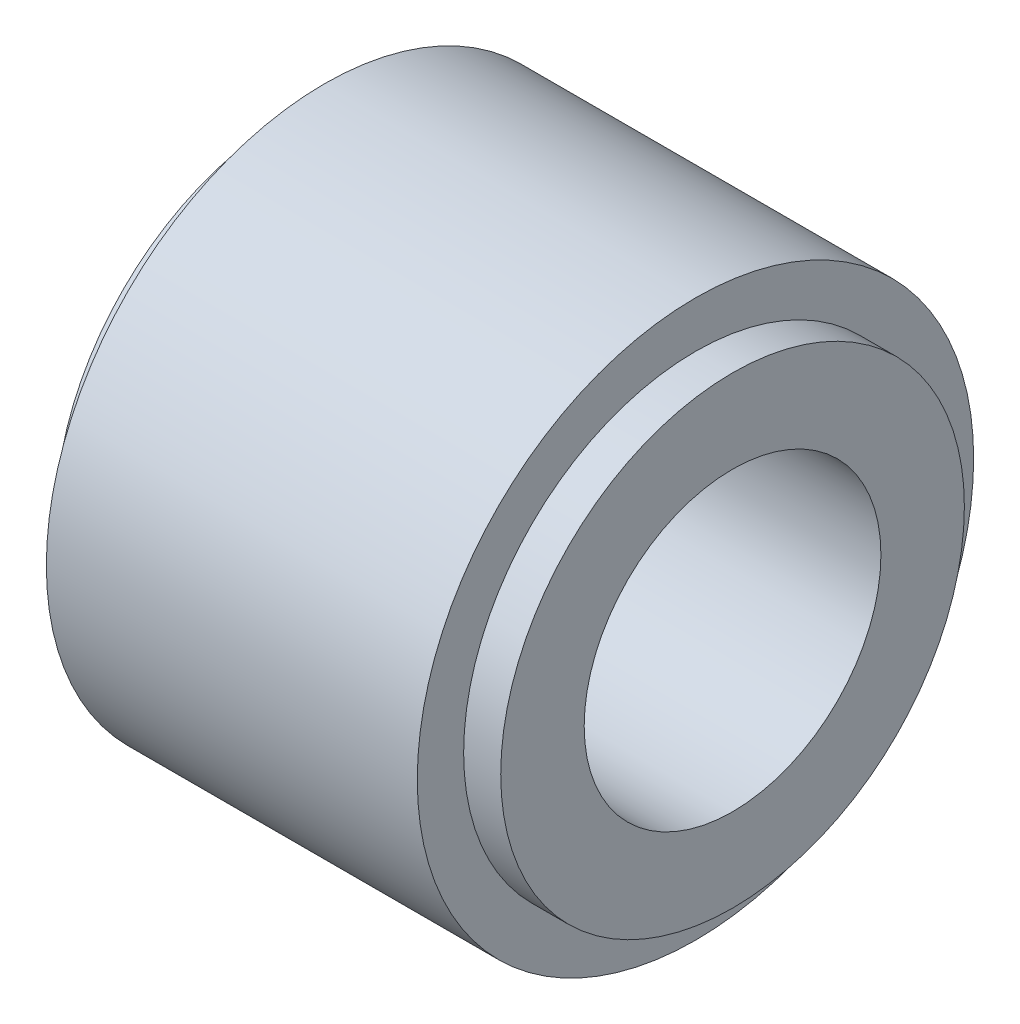
ISO-10303-21;
HEADER;
FILE_DESCRIPTION(('STEP AP214'),'2;1');
FILE_NAME('part.step','',(''),(''),'','','');
FILE_SCHEMA(('AUTOMOTIVE_DESIGN { 1 0 10303 214 1 1 1 1 }'));
ENDSEC;
DATA;
#1=APPLICATION_CONTEXT('core data for automotive mechanical design processes');
#2=APPLICATION_PROTOCOL_DEFINITION('international standard','automotive_design',2000,#1);
#3=PRODUCT_CONTEXT('',#1,'mechanical');
#4=PRODUCT('Part','Part','',(#3));
#5=PRODUCT_RELATED_PRODUCT_CATEGORY('part','',(#4));
#6=PRODUCT_DEFINITION_FORMATION('','',#4);
#7=PRODUCT_DEFINITION_CONTEXT('part definition',#1,'design');
#8=PRODUCT_DEFINITION('design','',#6,#7);
#9=PRODUCT_DEFINITION_SHAPE('','',#8);
#10=(LENGTH_UNIT() NAMED_UNIT(*) SI_UNIT(.MILLI.,.METRE.));
#11=(NAMED_UNIT(*) PLANE_ANGLE_UNIT() SI_UNIT($,.RADIAN.));
#12=(NAMED_UNIT(*) SI_UNIT($,.STERADIAN.) SOLID_ANGLE_UNIT());
#13=UNCERTAINTY_MEASURE_WITH_UNIT(LENGTH_MEASURE(1.E-05),#10,'distance_accuracy_value','');
#14=(GEOMETRIC_REPRESENTATION_CONTEXT(3) GLOBAL_UNCERTAINTY_ASSIGNED_CONTEXT((#13)) GLOBAL_UNIT_ASSIGNED_CONTEXT((#10,
#11,#12)) REPRESENTATION_CONTEXT('',''));
#15=CARTESIAN_POINT('',(0.,0.,0.));
#16=DIRECTION('',(0.,0.,1.));
#17=DIRECTION('',(1.,0.,0.));
#18=AXIS2_PLACEMENT_3D('',#15,#16,#17);
#19=CARTESIAN_POINT('',(0.,0.,0.));
#20=DIRECTION('',(1.,0.,0.));
#21=DIRECTION('',(0.,0.,-1.));
#22=AXIS2_PLACEMENT_3D('',#19,#20,#21);
#23=PLANE('',#22);
#24=CARTESIAN_POINT('',(0.,0.,0.));
#25=DIRECTION('',(-1.,0.,0.));
#26=DIRECTION('',(0.,0.,1.));
#27=AXIS2_PLACEMENT_3D('',#24,#25,#26);
#28=CIRCLE('',#27,12.5);
#29=CARTESIAN_POINT('',(0.,0.,12.5));
#30=VERTEX_POINT('',#29);
#31=EDGE_CURVE('E10',#30,#30,#28,.T.);
#32=ORIENTED_EDGE('',*,*,#31,.T.);
#33=EDGE_LOOP('',(#32));
#34=FACE_BOUND('',#33,.T.);
#35=CARTESIAN_POINT('',(0.,0.,0.));
#36=DIRECTION('',(-1.,0.,0.));
#37=DIRECTION('',(0.,0.,1.));
#38=AXIS2_PLACEMENT_3D('',#35,#36,#37);
#39=CIRCLE('',#38,8.);
#40=CARTESIAN_POINT('',(0.,0.,8.));
#41=VERTEX_POINT('',#40);
#42=EDGE_CURVE('E55',#41,#41,#39,.T.);
#43=ORIENTED_EDGE('',*,*,#42,.F.);
#44=EDGE_LOOP('',(#43));
#45=FACE_BOUND('',#44,.T.);
#46=ADVANCED_FACE('F30',(#34,#45),#23,.F.);
#47=CARTESIAN_POINT('',(24.,12.5,0.));
#48=DIRECTION('',(-1.,0.,0.));
#49=DIRECTION('',(0.,0.,1.));
#50=AXIS2_PLACEMENT_3D('',#47,#48,#49);
#51=PLANE('',#50);
#52=CARTESIAN_POINT('',(24.,0.,0.));
#53=DIRECTION('',(-1.,0.,0.));
#54=DIRECTION('',(0.,0.,1.));
#55=AXIS2_PLACEMENT_3D('',#52,#53,#54);
#56=CIRCLE('',#55,12.5);
#57=CARTESIAN_POINT('',(24.,0.,12.5));
#58=VERTEX_POINT('',#57);
#59=EDGE_CURVE('E52',#58,#58,#56,.T.);
#60=ORIENTED_EDGE('',*,*,#59,.F.);
#61=EDGE_LOOP('',(#60));
#62=FACE_BOUND('',#61,.T.);
#63=CARTESIAN_POINT('',(24.,0.,0.));
#64=DIRECTION('',(-1.,0.,0.));
#65=DIRECTION('',(0.,0.,1.));
#66=AXIS2_PLACEMENT_3D('',#63,#64,#65);
#67=CIRCLE('',#66,8.);
#68=CARTESIAN_POINT('',(24.,0.,8.));
#69=VERTEX_POINT('',#68);
#70=EDGE_CURVE('E58',#69,#69,#67,.T.);
#71=ORIENTED_EDGE('',*,*,#70,.T.);
#72=EDGE_LOOP('',(#71));
#73=FACE_BOUND('',#72,.T.);
#74=ADVANCED_FACE('F62',(#62,#73),#51,.F.);
#75=CARTESIAN_POINT('',(-4.04722976838154,0.,0.));
#76=DIRECTION('',(-1.,0.,0.));
#77=DIRECTION('',(0.,0.,1.));
#78=AXIS2_PLACEMENT_3D('',#75,#76,#77);
#79=CYLINDRICAL_SURFACE('',#78,12.5);
#80=ORIENTED_EDGE('',*,*,#31,.F.);
#81=EDGE_LOOP('',(#80));
#82=FACE_BOUND('',#81,.T.);
#83=CARTESIAN_POINT('',(2.,0.,0.));
#84=DIRECTION('',(-1.,0.,0.));
#85=DIRECTION('',(0.,0.,1.));
#86=AXIS2_PLACEMENT_3D('',#83,#84,#85);
#87=CIRCLE('',#86,12.5);
#88=CARTESIAN_POINT('',(2.,0.,12.5));
#89=VERTEX_POINT('',#88);
#90=EDGE_CURVE('E36',#89,#89,#87,.T.);
#91=ORIENTED_EDGE('',*,*,#90,.T.);
#92=EDGE_LOOP('',(#91));
#93=FACE_BOUND('',#92,.T.);
#94=ADVANCED_FACE('F80',(#82,#93),#79,.T.);
#95=CARTESIAN_POINT('',(2.,12.5,0.));
#96=DIRECTION('',(1.,0.,0.));
#97=DIRECTION('',(0.,0.,-1.));
#98=AXIS2_PLACEMENT_3D('',#95,#96,#97);
#99=PLANE('',#98);
#100=ORIENTED_EDGE('',*,*,#90,.F.);
#101=EDGE_LOOP('',(#100));
#102=FACE_BOUND('',#101,.T.);
#103=CARTESIAN_POINT('',(2.,0.,0.));
#104=DIRECTION('',(-1.,0.,0.));
#105=DIRECTION('',(0.,0.,1.));
#106=AXIS2_PLACEMENT_3D('',#103,#104,#105);
#107=CIRCLE('',#106,15.);
#108=CARTESIAN_POINT('',(2.,0.,15.));
#109=VERTEX_POINT('',#108);
#110=EDGE_CURVE('E40',#109,#109,#107,.T.);
#111=ORIENTED_EDGE('',*,*,#110,.T.);
#112=EDGE_LOOP('',(#111));
#113=FACE_BOUND('',#112,.T.);
#114=ADVANCED_FACE('F87',(#102,#113),#99,.F.);
#115=CARTESIAN_POINT('',(-4.04722976838154,0.,0.));
#116=DIRECTION('',(-1.,0.,0.));
#117=DIRECTION('',(0.,0.,1.));
#118=AXIS2_PLACEMENT_3D('',#115,#116,#117);
#119=CYLINDRICAL_SURFACE('',#118,15.);
#120=ORIENTED_EDGE('',*,*,#110,.F.);
#121=EDGE_LOOP('',(#120));
#122=FACE_BOUND('',#121,.T.);
#123=CARTESIAN_POINT('',(22.,0.,0.));
#124=DIRECTION('',(-1.,0.,0.));
#125=DIRECTION('',(0.,0.,1.));
#126=AXIS2_PLACEMENT_3D('',#123,#124,#125);
#127=CIRCLE('',#126,15.);
#128=CARTESIAN_POINT('',(22.,0.,15.));
#129=VERTEX_POINT('',#128);
#130=EDGE_CURVE('E44',#129,#129,#127,.T.);
#131=ORIENTED_EDGE('',*,*,#130,.T.);
#132=EDGE_LOOP('',(#131));
#133=FACE_BOUND('',#132,.T.);
#134=ADVANCED_FACE('F93',(#122,#133),#119,.T.);
#135=CARTESIAN_POINT('',(22.,15.,0.));
#136=DIRECTION('',(-1.,0.,0.));
#137=DIRECTION('',(0.,0.,1.));
#138=AXIS2_PLACEMENT_3D('',#135,#136,#137);
#139=PLANE('',#138);
#140=ORIENTED_EDGE('',*,*,#130,.F.);
#141=EDGE_LOOP('',(#140));
#142=FACE_BOUND('',#141,.T.);
#143=CARTESIAN_POINT('',(22.,0.,0.));
#144=DIRECTION('',(-1.,0.,0.));
#145=DIRECTION('',(0.,0.,1.));
#146=AXIS2_PLACEMENT_3D('',#143,#144,#145);
#147=CIRCLE('',#146,12.5);
#148=CARTESIAN_POINT('',(22.,0.,12.5));
#149=VERTEX_POINT('',#148);
#150=EDGE_CURVE('E49',#149,#149,#147,.T.);
#151=ORIENTED_EDGE('',*,*,#150,.T.);
#152=EDGE_LOOP('',(#151));
#153=FACE_BOUND('',#152,.T.);
#154=ADVANCED_FACE('F72',(#142,#153),#139,.F.);
#155=CARTESIAN_POINT('',(-4.04722976838154,0.,0.));
#156=DIRECTION('',(-1.,0.,0.));
#157=DIRECTION('',(0.,0.,1.));
#158=AXIS2_PLACEMENT_3D('',#155,#156,#157);
#159=CYLINDRICAL_SURFACE('',#158,12.5);
#160=ORIENTED_EDGE('',*,*,#150,.F.);
#161=EDGE_LOOP('',(#160));
#162=FACE_BOUND('',#161,.T.);
#163=ORIENTED_EDGE('',*,*,#59,.T.);
#164=EDGE_LOOP('',(#163));
#165=FACE_BOUND('',#164,.T.);
#166=ADVANCED_FACE('F66',(#162,#165),#159,.T.);
#167=CARTESIAN_POINT('',(-2.96863214359397,0.,0.));
#168=DIRECTION('',(-1.,0.,0.));
#169=DIRECTION('',(0.,0.,1.));
#170=AXIS2_PLACEMENT_3D('',#167,#168,#169);
#171=CYLINDRICAL_SURFACE('',#170,8.);
#172=ORIENTED_EDGE('',*,*,#42,.T.);
#173=EDGE_LOOP('',(#172));
#174=FACE_BOUND('',#173,.T.);
#175=ORIENTED_EDGE('',*,*,#70,.F.);
#176=EDGE_LOOP('',(#175));
#177=FACE_BOUND('',#176,.T.);
#178=ADVANCED_FACE('F64',(#174,#177),#171,.F.);
#179=CLOSED_SHELL('',(#46,#74,#94,#114,#134,#154,#166,#178));
#180=MANIFOLD_SOLID_BREP('B2',#179);
#181=ADVANCED_BREP_SHAPE_REPRESENTATION('',(#18,#180),#14);
#182=SHAPE_DEFINITION_REPRESENTATION(#9,#181);
ENDSEC;
END-ISO-10303-21;
